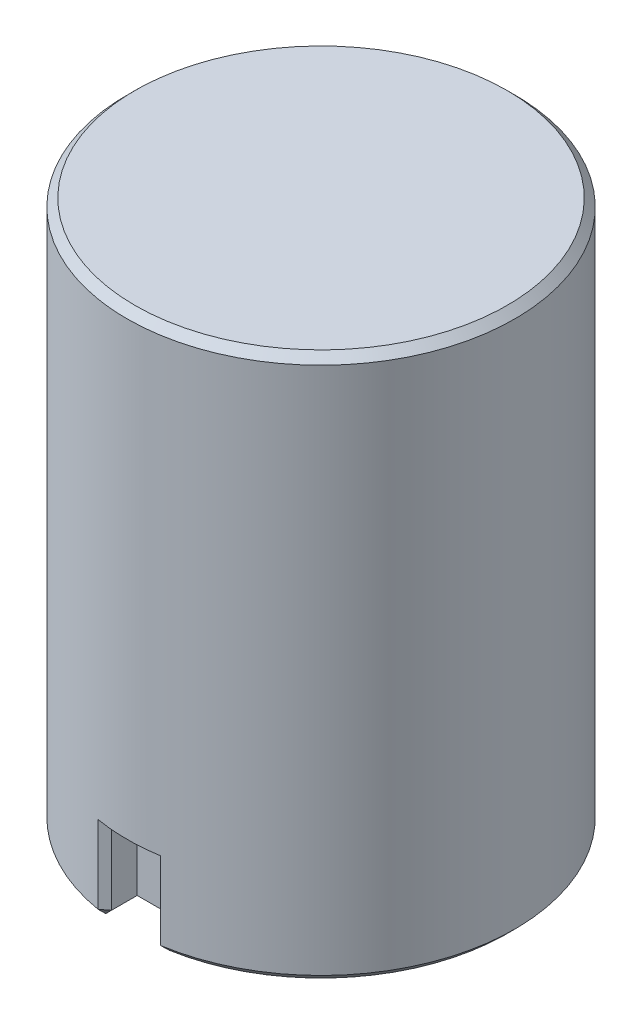
ISO-10303-21;
HEADER;
FILE_DESCRIPTION(('STEP AP214'),'2;1');
FILE_NAME('part.step','',(''),(''),'','','');
FILE_SCHEMA(('AUTOMOTIVE_DESIGN { 1 0 10303 214 1 1 1 1 }'));
ENDSEC;
DATA;
#1=APPLICATION_CONTEXT('core data for automotive mechanical design processes');
#2=APPLICATION_PROTOCOL_DEFINITION('international standard','automotive_design',2000,#1);
#3=PRODUCT_CONTEXT('',#1,'mechanical');
#4=PRODUCT('Part','Part','',(#3));
#5=PRODUCT_RELATED_PRODUCT_CATEGORY('part','',(#4));
#6=PRODUCT_DEFINITION_FORMATION('','',#4);
#7=PRODUCT_DEFINITION_CONTEXT('part definition',#1,'design');
#8=PRODUCT_DEFINITION('design','',#6,#7);
#9=PRODUCT_DEFINITION_SHAPE('','',#8);
#10=(LENGTH_UNIT() NAMED_UNIT(*) SI_UNIT(.MILLI.,.METRE.));
#11=(NAMED_UNIT(*) PLANE_ANGLE_UNIT() SI_UNIT($,.RADIAN.));
#12=(NAMED_UNIT(*) SI_UNIT($,.STERADIAN.) SOLID_ANGLE_UNIT());
#13=UNCERTAINTY_MEASURE_WITH_UNIT(LENGTH_MEASURE(1.E-05),#10,'distance_accuracy_value','');
#14=(GEOMETRIC_REPRESENTATION_CONTEXT(3) GLOBAL_UNCERTAINTY_ASSIGNED_CONTEXT((#13)) GLOBAL_UNIT_ASSIGNED_CONTEXT((#10,
#11,#12)) REPRESENTATION_CONTEXT('',''));
#15=CARTESIAN_POINT('',(0.,0.,0.));
#16=DIRECTION('',(0.,0.,1.));
#17=DIRECTION('',(1.,0.,0.));
#18=AXIS2_PLACEMENT_3D('',#15,#16,#17);
#19=CARTESIAN_POINT('',(0.,70.,0.));
#20=DIRECTION('',(0.,-1.,0.));
#21=DIRECTION('',(0.,0.,-1.));
#22=AXIS2_PLACEMENT_3D('',#19,#20,#21);
#23=CYLINDRICAL_SURFACE('',#22,24.95);
#24=CARTESIAN_POINT('',(0.,69.,0.));
#25=DIRECTION('',(0.,1.,0.));
#26=DIRECTION('',(0.,0.,1.));
#27=AXIS2_PLACEMENT_3D('',#24,#25,#26);
#28=CIRCLE('',#27,24.95);
#29=CARTESIAN_POINT('',(0.,69.,24.95));
#30=VERTEX_POINT('',#29);
#31=EDGE_CURVE('E144',#30,#30,#28,.F.);
#32=ORIENTED_EDGE('',*,*,#31,.T.);
#33=EDGE_LOOP('',(#32));
#34=FACE_BOUND('',#33,.T.);
#35=CARTESIAN_POINT('',(0.,11.,0.));
#36=DIRECTION('',(0.,-1.,0.));
#37=DIRECTION('',(0.,0.,-1.));
#38=AXIS2_PLACEMENT_3D('',#35,#36,#37);
#39=CIRCLE('',#38,24.95);
#40=CARTESIAN_POINT('',(3.97470140287935,11.,24.6313671719202));
#41=VERTEX_POINT('',#40);
#42=CARTESIAN_POINT('',(-4.07072261930712,11.,24.6156803147234));
#43=VERTEX_POINT('',#42);
#44=EDGE_CURVE('E114',#41,#43,#39,.T.);
#45=ORIENTED_EDGE('',*,*,#44,.F.);
#46=DIRECTION('',(0.,-1.,0.));
#47=VECTOR('',#46,1.);
#48=CARTESIAN_POINT('',(3.97470140287935,70.,24.6313671719202));
#49=LINE('',#48,#47);
#50=CARTESIAN_POINT('',(3.97470140287935,0.999999999999973,24.6313671719202));
#51=VERTEX_POINT('',#50);
#52=EDGE_CURVE('E141',#41,#51,#49,.T.);
#53=ORIENTED_EDGE('',*,*,#52,.T.);
#54=CARTESIAN_POINT('',(0.,0.999999999999973,0.));
#55=DIRECTION('',(0.,1.,0.));
#56=DIRECTION('',(0.,0.,1.));
#57=AXIS2_PLACEMENT_3D('',#54,#55,#56);
#58=CIRCLE('',#57,24.95);
#59=CARTESIAN_POINT('',(-4.07072261930712,0.999999999999973,24.6156803147234));
#60=VERTEX_POINT('',#59);
#61=EDGE_CURVE('E136',#51,#60,#58,.T.);
#62=ORIENTED_EDGE('',*,*,#61,.T.);
#63=DIRECTION('',(0.,-1.,0.));
#64=VECTOR('',#63,1.);
#65=CARTESIAN_POINT('',(-4.07072261930712,70.,24.6156803147234));
#66=LINE('',#65,#64);
#67=EDGE_CURVE('E138',#60,#43,#66,.F.);
#68=ORIENTED_EDGE('',*,*,#67,.T.);
#69=EDGE_LOOP('',(#45,#53,#62,#68));
#70=FACE_BOUND('',#69,.T.);
#71=ADVANCED_FACE('F35',(#34,#70),#23,.T.);
#72=CARTESIAN_POINT('',(0.,70.,0.));
#73=DIRECTION('',(0.,1.,0.));
#74=DIRECTION('',(0.,0.,1.));
#75=AXIS2_PLACEMENT_3D('',#72,#73,#74);
#76=PLANE('',#75);
#77=CARTESIAN_POINT('',(0.,70.,0.));
#78=DIRECTION('',(0.,1.,0.));
#79=DIRECTION('',(0.,0.,1.));
#80=AXIS2_PLACEMENT_3D('',#77,#78,#79);
#81=CIRCLE('',#80,23.95);
#82=CARTESIAN_POINT('',(0.,70.,23.95));
#83=VERTEX_POINT('',#82);
#84=EDGE_CURVE('E132',#83,#83,#81,.T.);
#85=ORIENTED_EDGE('',*,*,#84,.T.);
#86=EDGE_LOOP('',(#85));
#87=FACE_BOUND('',#86,.T.);
#88=ADVANCED_FACE('F229',(#87),#76,.T.);
#89=CARTESIAN_POINT('',(0.,0.,0.));
#90=DIRECTION('',(0.,1.,0.));
#91=DIRECTION('',(0.,0.,1.));
#92=AXIS2_PLACEMENT_3D('',#89,#90,#91);
#93=PLANE('',#92);
#94=CARTESIAN_POINT('',(0.,0.,0.));
#95=DIRECTION('',(0.,1.,0.));
#96=DIRECTION('',(0.,0.,1.));
#97=AXIS2_PLACEMENT_3D('',#94,#95,#96);
#98=CIRCLE('',#97,23.95);
#99=CARTESIAN_POINT('',(-4.09999999999998,0.,23.5964510043354));
#100=VERTEX_POINT('',#99);
#101=CARTESIAN_POINT('',(4.09999999999998,0.,23.5964510043354));
#102=VERTEX_POINT('',#101);
#103=EDGE_CURVE('E154',#100,#102,#98,.F.);
#104=ORIENTED_EDGE('',*,*,#103,.T.);
#105=DIRECTION('',(0.,0.,-1.));
#106=VECTOR('',#105,1.);
#107=CARTESIAN_POINT('',(4.09999999999998,0.,0.));
#108=LINE('',#107,#106);
#109=CARTESIAN_POINT('',(4.09999999999998,0.,19.5566657690409));
#110=VERTEX_POINT('',#109);
#111=EDGE_CURVE('E159',#102,#110,#108,.T.);
#112=ORIENTED_EDGE('',*,*,#111,.T.);
#113=DIRECTION('',(-1.,0.,0.));
#114=VECTOR('',#113,1.);
#115=CARTESIAN_POINT('',(0.,0.,19.5566657690409));
#116=LINE('',#115,#114);
#117=CARTESIAN_POINT('',(-4.09999999999998,0.,19.5566657690409));
#118=VERTEX_POINT('',#117);
#119=EDGE_CURVE('E60',#110,#118,#116,.T.);
#120=ORIENTED_EDGE('',*,*,#119,.T.);
#121=DIRECTION('',(0.,0.,1.));
#122=VECTOR('',#121,1.);
#123=CARTESIAN_POINT('',(-4.09999999999998,0.,0.));
#124=LINE('',#123,#122);
#125=EDGE_CURVE('E156',#118,#100,#124,.T.);
#126=ORIENTED_EDGE('',*,*,#125,.T.);
#127=EDGE_LOOP('',(#104,#112,#120,#126));
#128=FACE_BOUND('',#127,.T.);
#129=ADVANCED_FACE('F235',(#128),#93,.F.);
#130=CARTESIAN_POINT('',(3.1,11.,20.5566657690409));
#131=DIRECTION('',(1.,0.,0.));
#132=DIRECTION('',(0.,0.,-1.));
#133=AXIS2_PLACEMENT_3D('',#130,#131,#132);
#134=PLANE('',#133);
#135=DIRECTION('',(0.,0.,1.));
#136=VECTOR('',#135,1.);
#137=CARTESIAN_POINT('',(3.1,0.999999999999973,20.5566657690409));
#138=LINE('',#137,#136);
#139=CARTESIAN_POINT('',(3.1,0.999999999999973,20.5566657690409));
#140=VERTEX_POINT('',#139);
#141=CARTESIAN_POINT('',(3.1,0.999999999999973,23.7566657690409));
#142=VERTEX_POINT('',#141);
#143=EDGE_CURVE('E147',#140,#142,#138,.T.);
#144=ORIENTED_EDGE('',*,*,#143,.T.);
#145=DIRECTION('',(0.,1.,0.));
#146=VECTOR('',#145,1.);
#147=CARTESIAN_POINT('',(3.1,11.,23.7566657690409));
#148=LINE('',#147,#146);
#149=CARTESIAN_POINT('',(3.1,11.,23.7566657690409));
#150=VERTEX_POINT('',#149);
#151=EDGE_CURVE('E149',#142,#150,#148,.T.);
#152=ORIENTED_EDGE('',*,*,#151,.T.);
#153=DIRECTION('',(0.,0.,1.));
#154=VECTOR('',#153,1.);
#155=CARTESIAN_POINT('',(3.1,11.,20.5566657690409));
#156=LINE('',#155,#154);
#157=CARTESIAN_POINT('',(3.1,11.,20.5566657690409));
#158=VERTEX_POINT('',#157);
#159=EDGE_CURVE('E124',#158,#150,#156,.T.);
#160=ORIENTED_EDGE('',*,*,#159,.F.);
#161=DIRECTION('',(0.,-1.,0.));
#162=VECTOR('',#161,1.);
#163=CARTESIAN_POINT('',(3.1,11.,20.5566657690409));
#164=LINE('',#163,#162);
#165=EDGE_CURVE('E123',#158,#140,#164,.T.);
#166=ORIENTED_EDGE('',*,*,#165,.T.);
#167=EDGE_LOOP('',(#144,#152,#160,#166));
#168=FACE_BOUND('',#167,.T.);
#169=ADVANCED_FACE('F261',(#168),#134,.F.);
#170=CARTESIAN_POINT('',(3.1,11.,20.5566657690409));
#171=DIRECTION('',(0.,0.,-1.));
#172=DIRECTION('',(-1.,0.,0.));
#173=AXIS2_PLACEMENT_3D('',#170,#171,#172);
#174=PLANE('',#173);
#175=DIRECTION('',(0.,-1.,0.));
#176=VECTOR('',#175,1.);
#177=CARTESIAN_POINT('',(-3.1,11.,20.5566657690409));
#178=LINE('',#177,#176);
#179=CARTESIAN_POINT('',(-3.1,11.,20.5566657690409));
#180=VERTEX_POINT('',#179);
#181=CARTESIAN_POINT('',(-3.1,0.999999999999973,20.5566657690409));
#182=VERTEX_POINT('',#181);
#183=EDGE_CURVE('E117',#180,#182,#178,.T.);
#184=ORIENTED_EDGE('',*,*,#183,.T.);
#185=DIRECTION('',(1.,0.,0.));
#186=VECTOR('',#185,1.);
#187=CARTESIAN_POINT('',(3.1,0.999999999999973,20.5566657690409));
#188=LINE('',#187,#186);
#189=EDGE_CURVE('E161',#182,#140,#188,.T.);
#190=ORIENTED_EDGE('',*,*,#189,.T.);
#191=ORIENTED_EDGE('',*,*,#165,.F.);
#192=DIRECTION('',(1.,0.,0.));
#193=VECTOR('',#192,1.);
#194=CARTESIAN_POINT('',(3.1,11.,20.5566657690409));
#195=LINE('',#194,#193);
#196=EDGE_CURVE('E109',#180,#158,#195,.T.);
#197=ORIENTED_EDGE('',*,*,#196,.F.);
#198=EDGE_LOOP('',(#184,#190,#191,#197));
#199=FACE_BOUND('',#198,.T.);
#200=ADVANCED_FACE('F126',(#199),#174,.F.);
#201=CARTESIAN_POINT('',(-3.1,11.,20.5566657690409));
#202=DIRECTION('',(-1.,0.,0.));
#203=DIRECTION('',(0.,0.,1.));
#204=AXIS2_PLACEMENT_3D('',#201,#202,#203);
#205=PLANE('',#204);
#206=DIRECTION('',(0.,0.,-1.));
#207=VECTOR('',#206,1.);
#208=CARTESIAN_POINT('',(-3.1,11.,20.5566657690409));
#209=LINE('',#208,#207);
#210=CARTESIAN_POINT('',(-3.1,11.,23.8610094041744));
#211=VERTEX_POINT('',#210);
#212=EDGE_CURVE('E104',#211,#180,#209,.T.);
#213=ORIENTED_EDGE('',*,*,#212,.F.);
#214=DIRECTION('',(0.,-1.,0.));
#215=VECTOR('',#214,1.);
#216=CARTESIAN_POINT('',(-3.1,11.,23.8610094041744));
#217=LINE('',#216,#215);
#218=CARTESIAN_POINT('',(-3.1,0.999999999999973,23.8610094041744));
#219=VERTEX_POINT('',#218);
#220=EDGE_CURVE('E152',#211,#219,#217,.T.);
#221=ORIENTED_EDGE('',*,*,#220,.T.);
#222=DIRECTION('',(0.,0.,-1.));
#223=VECTOR('',#222,1.);
#224=CARTESIAN_POINT('',(-3.1,0.999999999999973,20.5566657690409));
#225=LINE('',#224,#223);
#226=EDGE_CURVE('E120',#219,#182,#225,.T.);
#227=ORIENTED_EDGE('',*,*,#226,.T.);
#228=ORIENTED_EDGE('',*,*,#183,.F.);
#229=EDGE_LOOP('',(#213,#221,#227,#228));
#230=FACE_BOUND('',#229,.T.);
#231=ADVANCED_FACE('F118',(#230),#205,.F.);
#232=CARTESIAN_POINT('',(0.,11.,0.));
#233=DIRECTION('',(0.,-1.,0.));
#234=DIRECTION('',(0.,0.,-1.));
#235=AXIS2_PLACEMENT_3D('',#232,#233,#234);
#236=PLANE('',#235);
#237=ORIENTED_EDGE('',*,*,#44,.T.);
#238=DIRECTION('',(-0.789484459580604,0.,0.613770550027224));
#239=VECTOR('',#238,1.);
#240=CARTESIAN_POINT('',(-3.1,11.,23.8610094041744));
#241=LINE('',#240,#239);
#242=EDGE_CURVE('E11',#43,#211,#241,.F.);
#243=ORIENTED_EDGE('',*,*,#242,.T.);
#244=ORIENTED_EDGE('',*,*,#212,.T.);
#245=ORIENTED_EDGE('',*,*,#196,.T.);
#246=ORIENTED_EDGE('',*,*,#159,.T.);
#247=DIRECTION('',(-0.707106781186545,0.,-0.70710678118655));
#248=VECTOR('',#247,1.);
#249=CARTESIAN_POINT('',(3.97470140287934,11.,24.6313671719202));
#250=LINE('',#249,#248);
#251=EDGE_CURVE('E45',#150,#41,#250,.F.);
#252=ORIENTED_EDGE('',*,*,#251,.T.);
#253=EDGE_LOOP('',(#237,#243,#244,#245,#246,#252));
#254=FACE_BOUND('',#253,.T.);
#255=ADVANCED_FACE('F106',(#254),#236,.T.);
#256=CARTESIAN_POINT('',(0.,70.,0.));
#257=DIRECTION('',(0.,-1.,0.));
#258=DIRECTION('',(0.,0.,-1.));
#259=AXIS2_PLACEMENT_3D('',#256,#257,#258);
#260=CONICAL_SURFACE('',#259,23.95,0.785398163397441);
#261=ORIENTED_EDGE('',*,*,#31,.F.);
#262=EDGE_LOOP('',(#261));
#263=FACE_BOUND('',#262,.T.);
#264=ORIENTED_EDGE('',*,*,#84,.F.);
#265=EDGE_LOOP('',(#264));
#266=FACE_BOUND('',#265,.T.);
#267=ADVANCED_FACE('F226',(#263,#266),#260,.T.);
#268=CARTESIAN_POINT('',(-3.1,70.,23.8610094041744));
#269=DIRECTION('',(-0.613770550027224,0.,-0.789484459580604));
#270=DIRECTION('',(0.,-1.,0.));
#271=AXIS2_PLACEMENT_3D('',#268,#269,#270);
#272=PLANE('',#271);
#273=ORIENTED_EDGE('',*,*,#242,.F.);
#274=ORIENTED_EDGE('',*,*,#67,.F.);
#275=DIRECTION('',(0.789484459580604,0.,-0.613770550027224));
#276=VECTOR('',#275,1.);
#277=CARTESIAN_POINT('',(-3.1,0.999999999999973,23.8610094041744));
#278=LINE('',#277,#276);
#279=EDGE_CURVE('E40',#219,#60,#278,.F.);
#280=ORIENTED_EDGE('',*,*,#279,.F.);
#281=ORIENTED_EDGE('',*,*,#220,.F.);
#282=EDGE_LOOP('',(#273,#274,#280,#281));
#283=FACE_BOUND('',#282,.T.);
#284=ADVANCED_FACE('F38',(#283),#272,.F.);
#285=CARTESIAN_POINT('',(-3.1,0.999999999999973,20.5566657690409));
#286=DIRECTION('',(-0.707106781186545,0.70710678118655,0.));
#287=DIRECTION('',(0.,0.,-1.));
#288=AXIS2_PLACEMENT_3D('',#285,#286,#287);
#289=PLANE('',#288);
#290=DIRECTION('',(0.577350269189627,0.577350269189623,0.577350269189627));
#291=VECTOR('',#290,1.);
#292=CARTESIAN_POINT('',(-1.03333333333332,3.06666666666663,22.6233324357075));
#293=LINE('',#292,#291);
#294=EDGE_CURVE('E204',#182,#118,#293,.F.);
#295=ORIENTED_EDGE('',*,*,#294,.F.);
#296=ORIENTED_EDGE('',*,*,#226,.F.);
#297=DIRECTION('',(-0.695049533168989,-0.695049533168984,-0.183881192304021));
#298=VECTOR('',#297,1.);
#299=CARTESIAN_POINT('',(-3.1,0.999999999999973,23.8610094041744));
#300=LINE('',#299,#298);
#301=EDGE_CURVE('E269',#100,#219,#300,.F.);
#302=ORIENTED_EDGE('',*,*,#301,.F.);
#303=ORIENTED_EDGE('',*,*,#125,.F.);
#304=EDGE_LOOP('',(#295,#296,#302,#303));
#305=FACE_BOUND('',#304,.T.);
#306=ADVANCED_FACE('F212',(#305),#289,.F.);
#307=CARTESIAN_POINT('',(-3.1,0.999999999999973,23.8610094041744));
#308=DIRECTION('',(0.473995949538181,-0.635295710956672,0.609694349212336));
#309=DIRECTION('',(0.,-0.692419803892717,-0.721494847644231));
#310=AXIS2_PLACEMENT_3D('',#307,#308,#309);
#311=PLANE('',#310);
#312=ORIENTED_EDGE('',*,*,#301,.T.);
#313=ORIENTED_EDGE('',*,*,#279,.T.);
#314=CARTESIAN_POINT('',(-4.07072261930712,0.999999999999973,24.6156803147234));
#315=CARTESIAN_POINT('',(-4.07574865270607,0.833279128917038,24.4458661529449));
#316=CARTESIAN_POINT('',(-4.08070145112403,0.666585360250352,24.2760232964022));
#317=CARTESIAN_POINT('',(-4.09046057802238,0.333252026916757,23.9362801929398));
#318=CARTESIAN_POINT('',(-4.09526690650204,0.166612462250118,23.7663799460198));
#319=CARTESIAN_POINT('',(-4.09999999999998,0.,23.5964510043354));
#320=B_SPLINE_CURVE_WITH_KNOTS('',3,(#314,#315,#316,#317,#318,#319),.UNSPECIFIED.,.F.,.F.,(4,2,
4),(0.,0.714087843186989,1.4281756899418),.UNSPECIFIED.);
#321=EDGE_CURVE('E197',#100,#60,#320,.F.);
#322=ORIENTED_EDGE('',*,*,#321,.F.);
#323=EDGE_LOOP('',(#312,#313,#322));
#324=FACE_BOUND('',#323,.T.);
#325=ADVANCED_FACE('F206',(#324),#311,.T.);
#326=CARTESIAN_POINT('',(3.1,0.999999999999973,20.5566657690409));
#327=DIRECTION('',(0.,0.70710678118655,-0.707106781186545));
#328=DIRECTION('',(1.,0.,0.));
#329=AXIS2_PLACEMENT_3D('',#326,#327,#328);
#330=PLANE('',#329);
#331=ORIENTED_EDGE('',*,*,#294,.T.);
#332=ORIENTED_EDGE('',*,*,#119,.F.);
#333=DIRECTION('',(-0.577350269189627,0.577350269189623,0.577350269189627));
#334=VECTOR('',#333,1.);
#335=CARTESIAN_POINT('',(3.1,0.999999999999973,20.5566657690409));
#336=LINE('',#335,#334);
#337=EDGE_CURVE('E53',#140,#110,#336,.F.);
#338=ORIENTED_EDGE('',*,*,#337,.F.);
#339=ORIENTED_EDGE('',*,*,#189,.F.);
#340=EDGE_LOOP('',(#331,#332,#338,#339));
#341=FACE_BOUND('',#340,.T.);
#342=ADVANCED_FACE('F193',(#341),#330,.F.);
#343=CARTESIAN_POINT('',(0.,0.999999999999973,0.));
#344=DIRECTION('',(0.,1.,0.));
#345=DIRECTION('',(0.,0.,1.));
#346=AXIS2_PLACEMENT_3D('',#343,#344,#345);
#347=CONICAL_SURFACE('',#346,24.95,0.785398163397452);
#348=ORIENTED_EDGE('',*,*,#321,.T.);
#349=ORIENTED_EDGE('',*,*,#61,.F.);
#350=CARTESIAN_POINT('',(4.09999999999998,0.,23.5964510043354));
#351=CARTESIAN_POINT('',(4.07938772478322,0.166554729328249,23.7690779852168));
#352=CARTESIAN_POINT('',(4.05864003731614,0.33316542810345,23.9416344904266));
#353=CARTESIAN_POINT('',(4.01687383827087,0.666498761438863,24.2866065462856));
#354=CARTESIAN_POINT('',(3.99585532669775,0.833221395996985,24.4590220969374));
#355=CARTESIAN_POINT('',(3.97470140287935,0.999999999999972,24.6313671719202));
#356=B_SPLINE_CURVE_WITH_KNOTS('',3,(#350,#351,#352,#353,#354,#355),.UNSPECIFIED.,.F.,.F.,(4,2,
4),(0.,0.722279759335902,1.44455950519884),.UNSPECIFIED.);
#357=EDGE_CURVE('E170',#102,#51,#356,.T.);
#358=ORIENTED_EDGE('',*,*,#357,.F.);
#359=ORIENTED_EDGE('',*,*,#103,.F.);
#360=EDGE_LOOP('',(#348,#349,#358,#359));
#361=FACE_BOUND('',#360,.T.);
#362=ADVANCED_FACE('F185',(#361),#347,.T.);
#363=CARTESIAN_POINT('',(3.1,0.999999999999973,20.5566657690409));
#364=DIRECTION('',(0.707106781186545,0.70710678118655,0.));
#365=DIRECTION('',(0.,0.,1.));
#366=AXIS2_PLACEMENT_3D('',#363,#364,#365);
#367=PLANE('',#366);
#368=ORIENTED_EDGE('',*,*,#337,.T.);
#369=ORIENTED_EDGE('',*,*,#111,.F.);
#370=DIRECTION('',(-0.702612357109145,0.70261235710914,0.112568873473396));
#371=VECTOR('',#370,1.);
#372=CARTESIAN_POINT('',(3.46262657252135,0.637373427478621,23.6985676380484));
#373=LINE('',#372,#371);
#374=EDGE_CURVE('E167',#142,#102,#373,.F.);
#375=ORIENTED_EDGE('',*,*,#374,.F.);
#376=ORIENTED_EDGE('',*,*,#143,.F.);
#377=EDGE_LOOP('',(#368,#369,#375,#376));
#378=FACE_BOUND('',#377,.T.);
#379=ADVANCED_FACE('F192',(#378),#367,.F.);
#380=CARTESIAN_POINT('',(3.97470140287935,0.999999999999973,24.6313671719202));
#381=DIRECTION('',(-0.546676811007244,-0.634262507652709,0.546676811007241));
#382=DIRECTION('',(0.757469735665907,-0.652870277735341,0.));
#383=AXIS2_PLACEMENT_3D('',#380,#381,#382);
#384=PLANE('',#383);
#385=ORIENTED_EDGE('',*,*,#374,.T.);
#386=ORIENTED_EDGE('',*,*,#357,.T.);
#387=DIRECTION('',(0.707106781186545,0.,0.70710678118655));
#388=VECTOR('',#387,1.);
#389=CARTESIAN_POINT('',(3.97470140287935,0.999999999999973,24.6313671719202));
#390=LINE('',#389,#388);
#391=EDGE_CURVE('E165',#142,#51,#390,.T.);
#392=ORIENTED_EDGE('',*,*,#391,.F.);
#393=EDGE_LOOP('',(#385,#386,#392));
#394=FACE_BOUND('',#393,.T.);
#395=ADVANCED_FACE('F181',(#394),#384,.T.);
#396=CARTESIAN_POINT('',(3.97470140287934,70.,24.6313671719202));
#397=DIRECTION('',(0.70710678118655,0.,-0.707106781186545));
#398=DIRECTION('',(0.,-1.,0.));
#399=AXIS2_PLACEMENT_3D('',#396,#397,#398);
#400=PLANE('',#399);
#401=ORIENTED_EDGE('',*,*,#251,.F.);
#402=ORIENTED_EDGE('',*,*,#151,.F.);
#403=ORIENTED_EDGE('',*,*,#391,.T.);
#404=ORIENTED_EDGE('',*,*,#52,.F.);
#405=EDGE_LOOP('',(#401,#402,#403,#404));
#406=FACE_BOUND('',#405,.T.);
#407=ADVANCED_FACE('F247',(#406),#400,.F.);
#408=CLOSED_SHELL('',(#71,#88,#129,#169,#200,#231,#255,#267,#284,#306,#325,#342,#362,#379,#395,#407));
#409=MANIFOLD_SOLID_BREP('B2',#408);
#410=ADVANCED_BREP_SHAPE_REPRESENTATION('',(#18,#409),#14);
#411=SHAPE_DEFINITION_REPRESENTATION(#9,#410);
ENDSEC;
END-ISO-10303-21;
